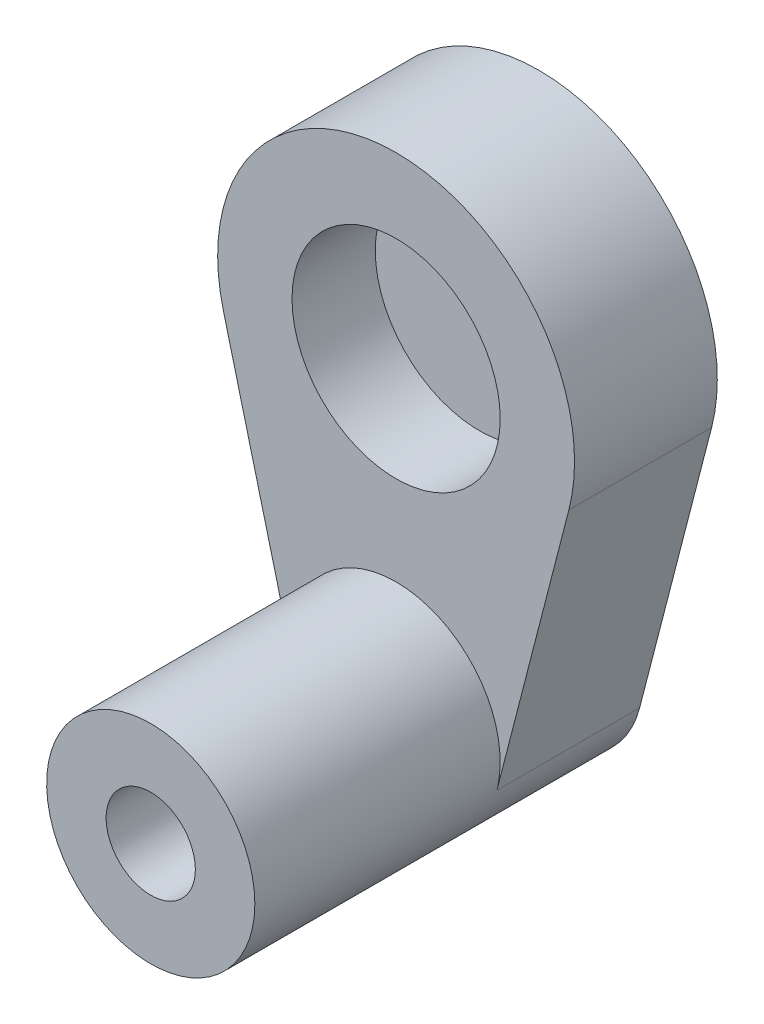
ISO-10303-21;
HEADER;
FILE_DESCRIPTION(('STEP AP214'),'2;1');
FILE_NAME('part.step','',(''),(''),'','','');
FILE_SCHEMA(('AUTOMOTIVE_DESIGN { 1 0 10303 214 1 1 1 1 }'));
ENDSEC;
DATA;
#1=APPLICATION_CONTEXT('core data for automotive mechanical design processes');
#2=APPLICATION_PROTOCOL_DEFINITION('international standard','automotive_design',2000,#1);
#3=PRODUCT_CONTEXT('',#1,'mechanical');
#4=PRODUCT('Part','Part','',(#3));
#5=PRODUCT_RELATED_PRODUCT_CATEGORY('part','',(#4));
#6=PRODUCT_DEFINITION_FORMATION('','',#4);
#7=PRODUCT_DEFINITION_CONTEXT('part definition',#1,'design');
#8=PRODUCT_DEFINITION('design','',#6,#7);
#9=PRODUCT_DEFINITION_SHAPE('','',#8);
#10=(LENGTH_UNIT() NAMED_UNIT(*) SI_UNIT(.MILLI.,.METRE.));
#11=(NAMED_UNIT(*) PLANE_ANGLE_UNIT() SI_UNIT($,.RADIAN.));
#12=(NAMED_UNIT(*) SI_UNIT($,.STERADIAN.) SOLID_ANGLE_UNIT());
#13=UNCERTAINTY_MEASURE_WITH_UNIT(LENGTH_MEASURE(1.E-05),#10,'distance_accuracy_value','');
#14=(GEOMETRIC_REPRESENTATION_CONTEXT(3) GLOBAL_UNCERTAINTY_ASSIGNED_CONTEXT((#13)) GLOBAL_UNIT_ASSIGNED_CONTEXT((#10,
#11,#12)) REPRESENTATION_CONTEXT('',''));
#15=CARTESIAN_POINT('',(0.,0.,0.));
#16=DIRECTION('',(0.,0.,1.));
#17=DIRECTION('',(1.,0.,0.));
#18=AXIS2_PLACEMENT_3D('',#15,#16,#17);
#19=CARTESIAN_POINT('',(0.,0.,8.25));
#20=DIRECTION('',(0.,0.,1.));
#21=DIRECTION('',(1.,0.,0.));
#22=AXIS2_PLACEMENT_3D('',#19,#20,#21);
#23=PLANE('',#22);
#24=CARTESIAN_POINT('',(0.,0.,8.25));
#25=DIRECTION('',(0.,0.,1.));
#26=DIRECTION('',(1.,0.,0.));
#27=AXIS2_PLACEMENT_3D('',#24,#25,#26);
#28=CIRCLE('',#27,3.5);
#29=CARTESIAN_POINT('',(3.5,0.,8.25));
#30=VERTEX_POINT('',#29);
#31=EDGE_CURVE('E11',#30,#30,#28,.T.);
#32=ORIENTED_EDGE('',*,*,#31,.T.);
#33=EDGE_LOOP('',(#32));
#34=FACE_BOUND('',#33,.T.);
#35=CARTESIAN_POINT('',(0.,0.,8.25));
#36=DIRECTION('',(0.,0.,1.));
#37=DIRECTION('',(1.,0.,0.));
#38=AXIS2_PLACEMENT_3D('',#35,#36,#37);
#39=CIRCLE('',#38,1.5);
#40=CARTESIAN_POINT('',(1.5,0.,8.25));
#41=VERTEX_POINT('',#40);
#42=EDGE_CURVE('E138',#41,#41,#39,.T.);
#43=ORIENTED_EDGE('',*,*,#42,.F.);
#44=EDGE_LOOP('',(#43));
#45=FACE_BOUND('',#44,.T.);
#46=ADVANCED_FACE('F41',(#34,#45),#23,.T.);
#47=CARTESIAN_POINT('',(0.,0.,8.25));
#48=DIRECTION('',(0.,0.,-1.));
#49=DIRECTION('',(-1.,0.,0.));
#50=AXIS2_PLACEMENT_3D('',#47,#48,#49);
#51=CYLINDRICAL_SURFACE('',#50,3.5);
#52=ORIENTED_EDGE('',*,*,#31,.F.);
#53=EDGE_LOOP('',(#52));
#54=FACE_BOUND('',#53,.T.);
#55=CARTESIAN_POINT('',(0.,0.,0.));
#56=DIRECTION('',(0.,0.,1.));
#57=DIRECTION('',(1.,0.,0.));
#58=AXIS2_PLACEMENT_3D('',#55,#56,#57);
#59=CIRCLE('',#58,3.5);
#60=CARTESIAN_POINT('',(3.38886042793149,-0.875000000000001,0.));
#61=VERTEX_POINT('',#60);
#62=CARTESIAN_POINT('',(-3.38886042793149,-0.875,0.));
#63=VERTEX_POINT('',#62);
#64=EDGE_CURVE('E45',#61,#63,#59,.T.);
#65=ORIENTED_EDGE('',*,*,#64,.T.);
#66=DIRECTION('',(0.,0.,1.));
#67=VECTOR('',#66,1.);
#68=CARTESIAN_POINT('',(-3.38886042793149,-0.875,-2.8));
#69=LINE('',#68,#67);
#70=CARTESIAN_POINT('',(-3.38886042793149,-0.875000000000001,-4.8));
#71=VERTEX_POINT('',#70);
#72=EDGE_CURVE('E130',#71,#63,#69,.T.);
#73=ORIENTED_EDGE('',*,*,#72,.F.);
#74=CARTESIAN_POINT('',(0.,0.,-4.8));
#75=DIRECTION('',(0.,0.,-1.));
#76=DIRECTION('',(-1.,0.,0.));
#77=AXIS2_PLACEMENT_3D('',#74,#75,#76);
#78=CIRCLE('',#77,3.5);
#79=CARTESIAN_POINT('',(3.38886042793149,-0.875,-4.8));
#80=VERTEX_POINT('',#79);
#81=EDGE_CURVE('E112',#80,#71,#78,.T.);
#82=ORIENTED_EDGE('',*,*,#81,.F.);
#83=DIRECTION('',(0.,0.,1.));
#84=VECTOR('',#83,1.);
#85=CARTESIAN_POINT('',(3.38886042793149,-0.875000000000001,-2.8));
#86=LINE('',#85,#84);
#87=EDGE_CURVE('E92',#80,#61,#86,.T.);
#88=ORIENTED_EDGE('',*,*,#87,.T.);
#89=EDGE_LOOP('',(#65,#73,#82,#88));
#90=FACE_BOUND('',#89,.T.);
#91=ADVANCED_FACE('F43',(#54,#90),#51,.T.);
#92=CARTESIAN_POINT('',(0.,0.,8.25));
#93=DIRECTION('',(0.,0.,-1.));
#94=DIRECTION('',(-1.,0.,0.));
#95=AXIS2_PLACEMENT_3D('',#92,#93,#94);
#96=CYLINDRICAL_SURFACE('',#95,1.5);
#97=ORIENTED_EDGE('',*,*,#42,.T.);
#98=EDGE_LOOP('',(#97));
#99=FACE_BOUND('',#98,.T.);
#100=CARTESIAN_POINT('',(0.,0.,0.));
#101=DIRECTION('',(0.,0.,1.));
#102=DIRECTION('',(1.,0.,0.));
#103=AXIS2_PLACEMENT_3D('',#100,#101,#102);
#104=CIRCLE('',#103,1.5);
#105=CARTESIAN_POINT('',(1.5,0.,0.));
#106=VERTEX_POINT('',#105);
#107=EDGE_CURVE('E137',#106,#106,#104,.T.);
#108=ORIENTED_EDGE('',*,*,#107,.F.);
#109=EDGE_LOOP('',(#108));
#110=FACE_BOUND('',#109,.T.);
#111=ADVANCED_FACE('F148',(#99,#110),#96,.F.);
#112=CARTESIAN_POINT('',(0.,0.,0.));
#113=DIRECTION('',(0.,0.,-1.));
#114=DIRECTION('',(-1.,0.,0.));
#115=AXIS2_PLACEMENT_3D('',#112,#113,#114);
#116=PLANE('',#115);
#117=ORIENTED_EDGE('',*,*,#107,.T.);
#118=EDGE_LOOP('',(#117));
#119=FACE_BOUND('',#118,.T.);
#120=ADVANCED_FACE('F146',(#119),#116,.F.);
#121=CARTESIAN_POINT('',(-3.38886042793149,-0.875,-2.8));
#122=DIRECTION('',(-0.968245836551854,-0.25,0.));
#123=DIRECTION('',(0.25,-0.968245836551854,0.));
#124=AXIS2_PLACEMENT_3D('',#121,#122,#123);
#125=PLANE('',#124);
#126=DIRECTION('',(0.25,-0.968245836551854,0.));
#127=VECTOR('',#126,1.);
#128=CARTESIAN_POINT('',(-3.38886042793149,-0.875,0.));
#129=LINE('',#128,#127);
#130=CARTESIAN_POINT('',(-5.80947501931113,8.5,0.));
#131=VERTEX_POINT('',#130);
#132=EDGE_CURVE('E57',#131,#63,#129,.T.);
#133=ORIENTED_EDGE('',*,*,#132,.F.);
#134=DIRECTION('',(0.,0.,1.));
#135=VECTOR('',#134,1.);
#136=CARTESIAN_POINT('',(-5.80947501931113,8.5,-2.8));
#137=LINE('',#136,#135);
#138=CARTESIAN_POINT('',(-5.80947501931113,8.5,-4.8));
#139=VERTEX_POINT('',#138);
#140=EDGE_CURVE('E91',#139,#131,#137,.T.);
#141=ORIENTED_EDGE('',*,*,#140,.F.);
#142=DIRECTION('',(-0.25,0.968245836551854,0.));
#143=VECTOR('',#142,1.);
#144=CARTESIAN_POINT('',(-3.38886042793149,-0.875,-4.8));
#145=LINE('',#144,#143);
#146=EDGE_CURVE('E101',#71,#139,#145,.T.);
#147=ORIENTED_EDGE('',*,*,#146,.F.);
#148=ORIENTED_EDGE('',*,*,#72,.T.);
#149=EDGE_LOOP('',(#133,#141,#147,#148));
#150=FACE_BOUND('',#149,.T.);
#151=ADVANCED_FACE('F156',(#150),#125,.T.);
#152=CARTESIAN_POINT('',(0.,10.,-2.8));
#153=DIRECTION('',(0.,0.,1.));
#154=DIRECTION('',(1.,0.,0.));
#155=AXIS2_PLACEMENT_3D('',#152,#153,#154);
#156=CYLINDRICAL_SURFACE('',#155,6.);
#157=CARTESIAN_POINT('',(0.,10.,0.));
#158=DIRECTION('',(0.,0.,-1.));
#159=DIRECTION('',(-1.,0.,0.));
#160=AXIS2_PLACEMENT_3D('',#157,#158,#159);
#161=CIRCLE('',#160,6.);
#162=CARTESIAN_POINT('',(5.80947501931113,8.5,0.));
#163=VERTEX_POINT('',#162);
#164=EDGE_CURVE('E87',#131,#163,#161,.T.);
#165=ORIENTED_EDGE('',*,*,#164,.T.);
#166=DIRECTION('',(0.,0.,1.));
#167=VECTOR('',#166,1.);
#168=CARTESIAN_POINT('',(5.80947501931113,8.5,-2.8));
#169=LINE('',#168,#167);
#170=CARTESIAN_POINT('',(5.80947501931113,8.50000000000001,-4.8));
#171=VERTEX_POINT('',#170);
#172=EDGE_CURVE('E83',#171,#163,#169,.T.);
#173=ORIENTED_EDGE('',*,*,#172,.F.);
#174=CARTESIAN_POINT('',(0.,10.,-4.8));
#175=DIRECTION('',(0.,0.,-1.));
#176=DIRECTION('',(-1.,0.,0.));
#177=AXIS2_PLACEMENT_3D('',#174,#175,#176);
#178=CIRCLE('',#177,6.);
#179=EDGE_CURVE('E86',#139,#171,#178,.T.);
#180=ORIENTED_EDGE('',*,*,#179,.F.);
#181=ORIENTED_EDGE('',*,*,#140,.T.);
#182=EDGE_LOOP('',(#165,#173,#180,#181));
#183=FACE_BOUND('',#182,.T.);
#184=ADVANCED_FACE('F85',(#183),#156,.T.);
#185=CARTESIAN_POINT('',(3.38886042793149,-0.875,-2.8));
#186=DIRECTION('',(-0.968245836551854,0.25,0.));
#187=DIRECTION('',(-0.25,-0.968245836551854,0.));
#188=AXIS2_PLACEMENT_3D('',#185,#186,#187);
#189=PLANE('',#188);
#190=DIRECTION('',(-0.25,-0.968245836551854,0.));
#191=VECTOR('',#190,1.);
#192=CARTESIAN_POINT('',(3.38886042793149,-0.875,0.));
#193=LINE('',#192,#191);
#194=EDGE_CURVE('E123',#163,#61,#193,.T.);
#195=ORIENTED_EDGE('',*,*,#194,.T.);
#196=ORIENTED_EDGE('',*,*,#87,.F.);
#197=DIRECTION('',(0.25,0.968245836551854,0.));
#198=VECTOR('',#197,1.);
#199=CARTESIAN_POINT('',(3.38886042793149,-0.875,-4.8));
#200=LINE('',#199,#198);
#201=EDGE_CURVE('E99',#80,#171,#200,.T.);
#202=ORIENTED_EDGE('',*,*,#201,.T.);
#203=ORIENTED_EDGE('',*,*,#172,.T.);
#204=EDGE_LOOP('',(#195,#196,#202,#203));
#205=FACE_BOUND('',#204,.T.);
#206=ADVANCED_FACE('F104',(#205),#189,.F.);
#207=CARTESIAN_POINT('',(0.,10.,-2.8));
#208=DIRECTION('',(0.,0.,1.));
#209=DIRECTION('',(1.,0.,0.));
#210=AXIS2_PLACEMENT_3D('',#207,#208,#209);
#211=CYLINDRICAL_SURFACE('',#210,3.5);
#212=CARTESIAN_POINT('',(0.,10.,-2.8));
#213=DIRECTION('',(0.,0.,-1.));
#214=DIRECTION('',(-1.,0.,0.));
#215=AXIS2_PLACEMENT_3D('',#212,#213,#214);
#216=CIRCLE('',#215,3.5);
#217=CARTESIAN_POINT('',(-3.5,10.,-2.8));
#218=VERTEX_POINT('',#217);
#219=EDGE_CURVE('E115',#218,#218,#216,.T.);
#220=ORIENTED_EDGE('',*,*,#219,.T.);
#221=EDGE_LOOP('',(#220));
#222=FACE_BOUND('',#221,.T.);
#223=CARTESIAN_POINT('',(0.,10.,0.));
#224=DIRECTION('',(0.,0.,-1.));
#225=DIRECTION('',(-1.,0.,0.));
#226=AXIS2_PLACEMENT_3D('',#223,#224,#225);
#227=CIRCLE('',#226,3.5);
#228=CARTESIAN_POINT('',(-3.5,10.,0.));
#229=VERTEX_POINT('',#228);
#230=EDGE_CURVE('E126',#229,#229,#227,.T.);
#231=ORIENTED_EDGE('',*,*,#230,.F.);
#232=EDGE_LOOP('',(#231));
#233=FACE_BOUND('',#232,.T.);
#234=ADVANCED_FACE('F174',(#222,#233),#211,.F.);
#235=ORIENTED_EDGE('',*,*,#64,.F.);
#236=ORIENTED_EDGE('',*,*,#194,.F.);
#237=ORIENTED_EDGE('',*,*,#164,.F.);
#238=ORIENTED_EDGE('',*,*,#132,.T.);
#239=EDGE_LOOP('',(#235,#236,#237,#238));
#240=FACE_BOUND('',#239,.T.);
#241=ORIENTED_EDGE('',*,*,#230,.T.);
#242=EDGE_LOOP('',(#241));
#243=FACE_BOUND('',#242,.T.);
#244=ADVANCED_FACE('F158',(#240,#243),#116,.F.);
#245=CARTESIAN_POINT('',(0.,10.,-2.8));
#246=DIRECTION('',(0.,0.,-1.));
#247=DIRECTION('',(-1.,0.,0.));
#248=AXIS2_PLACEMENT_3D('',#245,#246,#247);
#249=PLANE('',#248);
#250=ORIENTED_EDGE('',*,*,#219,.F.);
#251=EDGE_LOOP('',(#250));
#252=FACE_BOUND('',#251,.T.);
#253=ADVANCED_FACE('F173',(#252),#249,.F.);
#254=CARTESIAN_POINT('',(0.,10.,-4.8));
#255=DIRECTION('',(0.,0.,-1.));
#256=DIRECTION('',(-1.,0.,0.));
#257=AXIS2_PLACEMENT_3D('',#254,#255,#256);
#258=PLANE('',#257);
#259=ORIENTED_EDGE('',*,*,#201,.F.);
#260=ORIENTED_EDGE('',*,*,#81,.T.);
#261=ORIENTED_EDGE('',*,*,#146,.T.);
#262=ORIENTED_EDGE('',*,*,#179,.T.);
#263=EDGE_LOOP('',(#259,#260,#261,#262));
#264=FACE_BOUND('',#263,.T.);
#265=ADVANCED_FACE('F97',(#264),#258,.T.);
#266=CLOSED_SHELL('',(#46,#91,#111,#120,#151,#184,#206,#234,#244,#253,#265));
#267=MANIFOLD_SOLID_BREP('B2',#266);
#268=ADVANCED_BREP_SHAPE_REPRESENTATION('',(#18,#267),#14);
#269=SHAPE_DEFINITION_REPRESENTATION(#9,#268);
ENDSEC;
END-ISO-10303-21;
